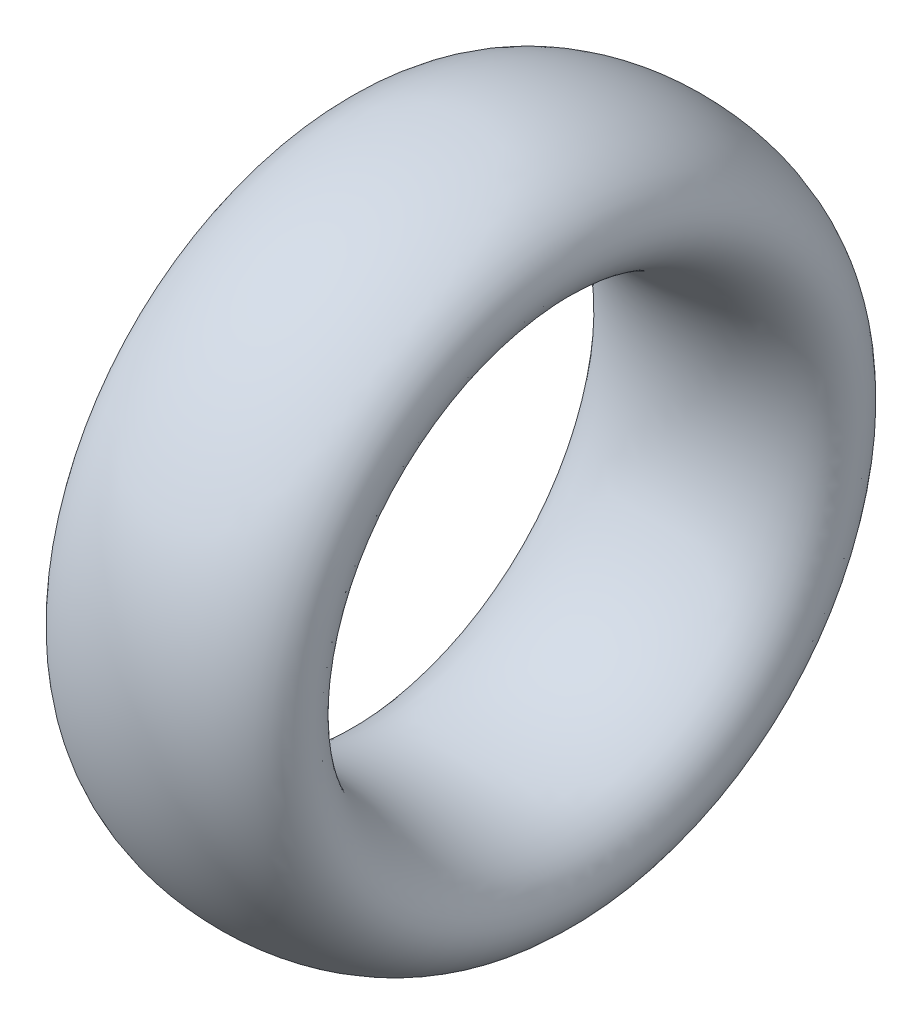
ISO-10303-21;
HEADER;
FILE_DESCRIPTION(('STEP AP214'),'2;1');
FILE_NAME('part.step','',(''),(''),'','','');
FILE_SCHEMA(('AUTOMOTIVE_DESIGN { 1 0 10303 214 1 1 1 1 }'));
ENDSEC;
DATA;
#1=APPLICATION_CONTEXT('core data for automotive mechanical design processes');
#2=APPLICATION_PROTOCOL_DEFINITION('international standard','automotive_design',2000,#1);
#3=PRODUCT_CONTEXT('',#1,'mechanical');
#4=PRODUCT('Part','Part','',(#3));
#5=PRODUCT_RELATED_PRODUCT_CATEGORY('part','',(#4));
#6=PRODUCT_DEFINITION_FORMATION('','',#4);
#7=PRODUCT_DEFINITION_CONTEXT('part definition',#1,'design');
#8=PRODUCT_DEFINITION('design','',#6,#7);
#9=PRODUCT_DEFINITION_SHAPE('','',#8);
#10=(LENGTH_UNIT() NAMED_UNIT(*) SI_UNIT(.MILLI.,.METRE.));
#11=(NAMED_UNIT(*) PLANE_ANGLE_UNIT() SI_UNIT($,.RADIAN.));
#12=(NAMED_UNIT(*) SI_UNIT($,.STERADIAN.) SOLID_ANGLE_UNIT());
#13=UNCERTAINTY_MEASURE_WITH_UNIT(LENGTH_MEASURE(1.E-05),#10,'distance_accuracy_value','');
#14=(GEOMETRIC_REPRESENTATION_CONTEXT(3) GLOBAL_UNCERTAINTY_ASSIGNED_CONTEXT((#13)) GLOBAL_UNIT_ASSIGNED_CONTEXT((#10,
#11,#12)) REPRESENTATION_CONTEXT('',''));
#15=CARTESIAN_POINT('',(0.,0.,0.));
#16=DIRECTION('',(0.,0.,1.));
#17=DIRECTION('',(1.,0.,0.));
#18=AXIS2_PLACEMENT_3D('',#15,#16,#17);
#19=CARTESIAN_POINT('',(1.2,2.65,0.));
#20=DIRECTION('',(0.,0.,1.));
#21=DIRECTION('',(1.,0.,0.));
#22=AXIS2_PLACEMENT_3D('',#19,#20,#21);
#23=ELLIPSE('',#22,1.2,0.649999999999998);
#24=CARTESIAN_POINT('',(0.,0.,0.));
#25=DIRECTION('',(-1.,0.,0.));
#26=AXIS1_PLACEMENT('',#24,#25);
#27=SURFACE_OF_REVOLUTION('',#23,#26);
#28=ADVANCED_FACE('F29',(),#27,.T.);
#29=CLOSED_SHELL('',(#28));
#30=MANIFOLD_SOLID_BREP('B2',#29);
#31=ADVANCED_BREP_SHAPE_REPRESENTATION('',(#18,#30),#14);
#32=SHAPE_DEFINITION_REPRESENTATION(#9,#31);
ENDSEC;
END-ISO-10303-21;
